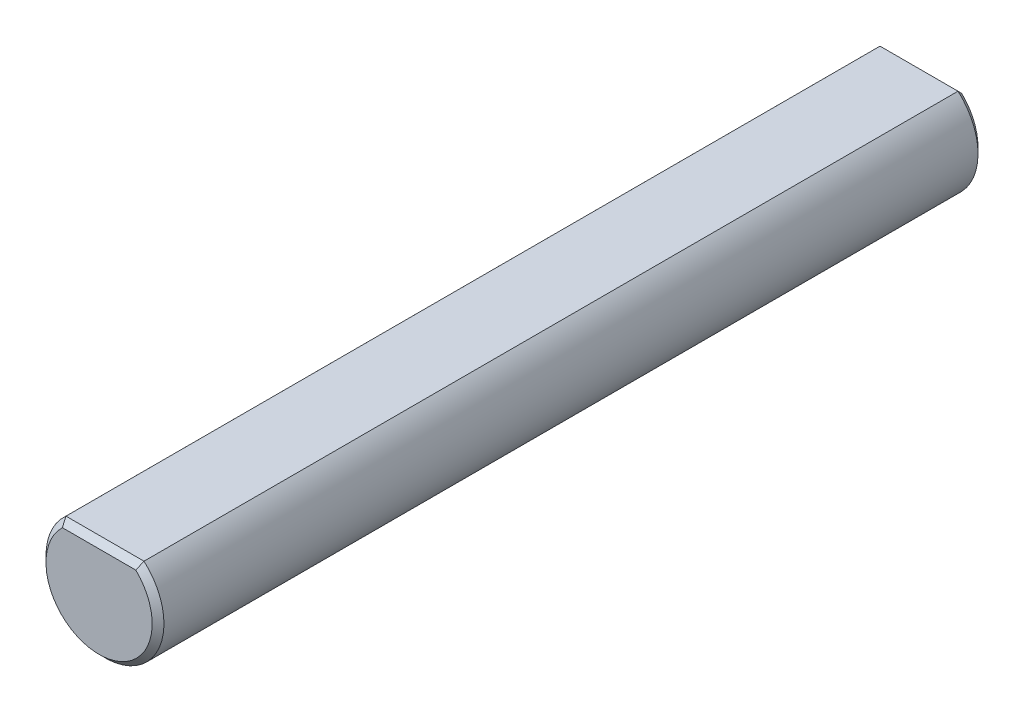
ISO-10303-21;
HEADER;
FILE_DESCRIPTION(('STEP AP214'),'2;1');
FILE_NAME('part.step','',(''),(''),'','','');
FILE_SCHEMA(('AUTOMOTIVE_DESIGN { 1 0 10303 214 1 1 1 1 }'));
ENDSEC;
DATA;
#1=APPLICATION_CONTEXT('core data for automotive mechanical design processes');
#2=APPLICATION_PROTOCOL_DEFINITION('international standard','automotive_design',2000,#1);
#3=PRODUCT_CONTEXT('',#1,'mechanical');
#4=PRODUCT('Part','Part','',(#3));
#5=PRODUCT_RELATED_PRODUCT_CATEGORY('part','',(#4));
#6=PRODUCT_DEFINITION_FORMATION('','',#4);
#7=PRODUCT_DEFINITION_CONTEXT('part definition',#1,'design');
#8=PRODUCT_DEFINITION('design','',#6,#7);
#9=PRODUCT_DEFINITION_SHAPE('','',#8);
#10=(LENGTH_UNIT() NAMED_UNIT(*) SI_UNIT(.MILLI.,.METRE.));
#11=(NAMED_UNIT(*) PLANE_ANGLE_UNIT() SI_UNIT($,.RADIAN.));
#12=(NAMED_UNIT(*) SI_UNIT($,.STERADIAN.) SOLID_ANGLE_UNIT());
#13=UNCERTAINTY_MEASURE_WITH_UNIT(LENGTH_MEASURE(1.E-05),#10,'distance_accuracy_value','');
#14=(GEOMETRIC_REPRESENTATION_CONTEXT(3) GLOBAL_UNCERTAINTY_ASSIGNED_CONTEXT((#13)) GLOBAL_UNIT_ASSIGNED_CONTEXT((#10,
#11,#12)) REPRESENTATION_CONTEXT('',''));
#15=CARTESIAN_POINT('',(0.,0.,0.));
#16=DIRECTION('',(0.,0.,1.));
#17=DIRECTION('',(1.,0.,0.));
#18=AXIS2_PLACEMENT_3D('',#15,#16,#17);
#19=CARTESIAN_POINT('',(0.,1.5,27.8));
#20=DIRECTION('',(0.,-0.707106781186548,-0.707106781186548));
#21=DIRECTION('',(0.,0.707106781186548,-0.707106781186548));
#22=AXIS2_PLACEMENT_3D('',#19,#20,#21);
#23=PLANE('',#22);
#24=CARTESIAN_POINT('',(-1.24498995975797,1.30000000002028,27.9999999999797));
#25=CARTESIAN_POINT('',(-1.25833682015506,1.33326211368723,27.9667378863128));
#26=CARTESIAN_POINT('',(-1.27150072999943,1.36655985043145,27.9334401495685));
#27=CARTESIAN_POINT('',(-1.29746262799343,1.43322651720392,27.8667734827961));
#28=CARTESIAN_POINT('',(-1.31026061672343,1.46659544711915,27.8334045528808));
#29=CARTESIAN_POINT('',(-1.32287565548107,1.49999999999866,27.8000000000013));
#30=B_SPLINE_CURVE_WITH_KNOTS('',3,(#24,#25,#26,#27,#28,#29),.UNSPECIFIED.,.F.,.F.,(4,2,4),(0.,
0.146686412467866,0.29337259227421),.UNSPECIFIED.);
#31=CARTESIAN_POINT('',(-1.24498995977646,1.3,27.9999999999816));
#32=VERTEX_POINT('',#31);
#33=CARTESIAN_POINT('',(-1.32287565550642,1.49999999999938,27.8000000000006));
#34=VERTEX_POINT('',#33);
#35=EDGE_CURVE('E62',#32,#34,#30,.T.);
#36=ORIENTED_EDGE('',*,*,#35,.F.);
#37=DIRECTION('',(1.,0.,0.));
#38=VECTOR('',#37,1.);
#39=CARTESIAN_POINT('',(0.,1.3,28.));
#40=LINE('',#39,#38);
#41=CARTESIAN_POINT('',(1.24498995978053,1.30000000001014,27.9999999999714));
#42=VERTEX_POINT('',#41);
#43=EDGE_CURVE('E74',#42,#32,#40,.F.);
#44=ORIENTED_EDGE('',*,*,#43,.F.);
#45=CARTESIAN_POINT('',(1.32287565548092,1.49999999999977,27.8000000000002));
#46=CARTESIAN_POINT('',(1.31026061672342,1.46659544712006,27.8334045528799));
#47=CARTESIAN_POINT('',(1.29746262799354,1.43322651720462,27.8667734827954));
#48=CARTESIAN_POINT('',(1.27150072999972,1.36655985043176,27.9334401495682));
#49=CARTESIAN_POINT('',(1.25833682015543,1.33326211368734,27.9667378863127));
#50=CARTESIAN_POINT('',(1.24498995975839,1.3000000000202,27.9999999999798));
#51=B_SPLINE_CURVE_WITH_KNOTS('',3,(#45,#46,#47,#48,#49,#50),.UNSPECIFIED.,.F.,.F.,(4,2,4),(0.,
0.146686179807085,0.293372592275692),.UNSPECIFIED.);
#52=CARTESIAN_POINT('',(1.32287565550661,1.49999999999989,27.7999999999981));
#53=VERTEX_POINT('',#52);
#54=EDGE_CURVE('E21',#53,#42,#51,.T.);
#55=ORIENTED_EDGE('',*,*,#54,.F.);
#56=DIRECTION('',(1.,0.,0.));
#57=VECTOR('',#56,1.);
#58=CARTESIAN_POINT('',(0.,1.5,27.8));
#59=LINE('',#58,#57);
#60=EDGE_CURVE('E72',#34,#53,#59,.T.);
#61=ORIENTED_EDGE('',*,*,#60,.F.);
#62=EDGE_LOOP('',(#36,#44,#55,#61));
#63=FACE_BOUND('',#62,.T.);
#64=ADVANCED_FACE('F17',(#63),#23,.F.);
#65=CARTESIAN_POINT('',(0.,1.3,0.));
#66=DIRECTION('',(0.,0.707106781186548,-0.707106781186548));
#67=DIRECTION('',(0.,0.707106781186548,0.707106781186548));
#68=AXIS2_PLACEMENT_3D('',#65,#66,#67);
#69=PLANE('',#68);
#70=CARTESIAN_POINT('',(1.24498995966782,1.30000000007248,5.93277109297435E-11));
#71=CARTESIAN_POINT('',(1.25833682006215,1.33326211373519,0.0332621137286123));
#72=CARTESIAN_POINT('',(1.27150072990419,1.36655985047618,0.0665598504739916));
#73=CARTESIAN_POINT('',(1.29746262789441,1.43322651724421,0.133226517246398));
#74=CARTESIAN_POINT('',(1.31026061662295,1.46659544715823,0.166595447160421));
#75=CARTESIAN_POINT('',(1.32287565537957,1.50000000003754,0.200000000037534));
#76=B_SPLINE_CURVE_WITH_KNOTS('',3,(#70,#71,#72,#73,#74,#75),.UNSPECIFIED.,.F.,.F.,(4,2,4),(0.,
0.146686412461755,0.293372592261994),.UNSPECIFIED.);
#77=CARTESIAN_POINT('',(1.24498995972612,1.30000000004097,9.00401118724553E-11));
#78=VERTEX_POINT('',#77);
#79=CARTESIAN_POINT('',(1.32287565544856,1.5,0.199999999999999));
#80=VERTEX_POINT('',#79);
#81=EDGE_CURVE('E75',#78,#80,#76,.T.);
#82=ORIENTED_EDGE('',*,*,#81,.F.);
#83=DIRECTION('',(1.,0.,0.));
#84=VECTOR('',#83,1.);
#85=CARTESIAN_POINT('',(0.,1.30000000001554,0.));
#86=LINE('',#85,#84);
#87=CARTESIAN_POINT('',(-1.24498995972612,1.30000000004097,9.0040118703576E-11));
#88=VERTEX_POINT('',#87);
#89=EDGE_CURVE('E87',#78,#88,#86,.F.);
#90=ORIENTED_EDGE('',*,*,#89,.T.);
#91=CARTESIAN_POINT('',(-1.32287565538393,1.50000000005057,0.200000000020285));
#92=CARTESIAN_POINT('',(-1.31026061662532,1.46659544716538,0.166595447150239));
#93=CARTESIAN_POINT('',(-1.29746262789525,1.43322651724682,0.133226517241769));
#94=CARTESIAN_POINT('',(-1.27150072990289,1.36655985047239,0.0665598504774322));
#95=CARTESIAN_POINT('',(-1.25833682006025,1.33326211372952,0.03326211373457));
#96=CARTESIAN_POINT('',(-1.24498995966578,1.30000000006629,6.62876525466181E-11));
#97=B_SPLINE_CURVE_WITH_KNOTS('',3,(#91,#92,#93,#94,#95,#96),.UNSPECIFIED.,.F.,.F.,(4,2,4),(0.,
0.146686179799369,0.293372592260281),.UNSPECIFIED.);
#98=CARTESIAN_POINT('',(-1.32287565545544,1.50000000001822,0.2000000000199));
#99=VERTEX_POINT('',#98);
#100=EDGE_CURVE('E91',#99,#88,#97,.T.);
#101=ORIENTED_EDGE('',*,*,#100,.F.);
#102=DIRECTION('',(1.,0.,0.));
#103=VECTOR('',#102,1.);
#104=CARTESIAN_POINT('',(0.,1.5,0.199999999999999));
#105=LINE('',#104,#103);
#106=EDGE_CURVE('E82',#80,#99,#105,.F.);
#107=ORIENTED_EDGE('',*,*,#106,.F.);
#108=EDGE_LOOP('',(#82,#90,#101,#107));
#109=FACE_BOUND('',#108,.T.);
#110=ADVANCED_FACE('F110',(#109),#69,.T.);
#111=CARTESIAN_POINT('',(0.,0.,28.));
#112=DIRECTION('',(0.,0.,1.));
#113=DIRECTION('',(1.,0.,0.));
#114=AXIS2_PLACEMENT_3D('',#111,#112,#113);
#115=PLANE('',#114);
#116=ORIENTED_EDGE('',*,*,#43,.T.);
#117=CARTESIAN_POINT('',(0.,0.,27.9999999999632));
#118=DIRECTION('',(0.,0.,-1.));
#119=DIRECTION('',(-1.,0.,0.));
#120=AXIS2_PLACEMENT_3D('',#117,#118,#119);
#121=CIRCLE('',#120,1.80000000000291);
#122=EDGE_CURVE('E86',#42,#32,#121,.T.);
#123=ORIENTED_EDGE('',*,*,#122,.F.);
#124=EDGE_LOOP('',(#116,#123));
#125=FACE_BOUND('',#124,.T.);
#126=ADVANCED_FACE('F114',(#125),#115,.T.);
#127=CARTESIAN_POINT('',(0.,1.5,28.));
#128=DIRECTION('',(0.,1.,0.));
#129=DIRECTION('',(0.,0.,1.));
#130=AXIS2_PLACEMENT_3D('',#127,#128,#129);
#131=PLANE('',#130);
#132=DIRECTION('',(0.,0.,-1.));
#133=VECTOR('',#132,1.);
#134=CARTESIAN_POINT('',(1.32287565550936,1.50000000002023,28.));
#135=LINE('',#134,#133);
#136=EDGE_CURVE('E80',#80,#53,#135,.F.);
#137=ORIENTED_EDGE('',*,*,#136,.F.);
#138=ORIENTED_EDGE('',*,*,#106,.T.);
#139=DIRECTION('',(0.,0.,-1.));
#140=VECTOR('',#139,1.);
#141=CARTESIAN_POINT('',(-1.32287565551787,1.50000000001272,28.));
#142=LINE('',#141,#140);
#143=EDGE_CURVE('E81',#34,#99,#142,.T.);
#144=ORIENTED_EDGE('',*,*,#143,.F.);
#145=ORIENTED_EDGE('',*,*,#60,.T.);
#146=EDGE_LOOP('',(#137,#138,#144,#145));
#147=FACE_BOUND('',#146,.T.);
#148=ADVANCED_FACE('F78',(#147),#131,.T.);
#149=CARTESIAN_POINT('',(0.,0.,0.));
#150=DIRECTION('',(0.,0.,1.));
#151=DIRECTION('',(1.,0.,0.));
#152=AXIS2_PLACEMENT_3D('',#149,#150,#151);
#153=PLANE('',#152);
#154=ORIENTED_EDGE('',*,*,#89,.F.);
#155=CARTESIAN_POINT('',(0.,0.,1.13686837721616E-10));
#156=DIRECTION('',(0.,0.,1.));
#157=DIRECTION('',(1.,0.,0.));
#158=AXIS2_PLACEMENT_3D('',#155,#156,#157);
#159=CIRCLE('',#158,1.80000000000291);
#160=EDGE_CURVE('E68',#88,#78,#159,.T.);
#161=ORIENTED_EDGE('',*,*,#160,.F.);
#162=EDGE_LOOP('',(#154,#161));
#163=FACE_BOUND('',#162,.T.);
#164=ADVANCED_FACE('F129',(#163),#153,.F.);
#165=CARTESIAN_POINT('',(0.,0.,27.8000000000702));
#166=DIRECTION('',(0.,0.,-1.));
#167=DIRECTION('',(-1.,0.,0.));
#168=AXIS2_PLACEMENT_3D('',#165,#166,#167);
#169=CONICAL_SURFACE('',#168,1.99999999989586,0.785398163397448);
#170=ORIENTED_EDGE('',*,*,#122,.T.);
#171=ORIENTED_EDGE('',*,*,#35,.T.);
#172=CARTESIAN_POINT('',(0.,0.,27.8));
#173=DIRECTION('',(0.,0.,-1.));
#174=DIRECTION('',(-1.,0.,0.));
#175=AXIS2_PLACEMENT_3D('',#172,#173,#174);
#176=CIRCLE('',#175,2.);
#177=EDGE_CURVE('E31',#53,#34,#176,.T.);
#178=ORIENTED_EDGE('',*,*,#177,.F.);
#179=ORIENTED_EDGE('',*,*,#54,.T.);
#180=EDGE_LOOP('',(#170,#171,#178,#179));
#181=FACE_BOUND('',#180,.T.);
#182=ADVANCED_FACE('F59',(#181),#169,.T.);
#183=CARTESIAN_POINT('',(0.,0.,0.200000000063483));
#184=DIRECTION('',(0.,0.,1.));
#185=DIRECTION('',(1.,0.,0.));
#186=AXIS2_PLACEMENT_3D('',#183,#184,#185);
#187=CONICAL_SURFACE('',#186,1.99999999995271,0.785398163397448);
#188=ORIENTED_EDGE('',*,*,#160,.T.);
#189=ORIENTED_EDGE('',*,*,#81,.T.);
#190=CARTESIAN_POINT('',(0.,0.,0.199999999999999));
#191=DIRECTION('',(0.,0.,-1.));
#192=DIRECTION('',(-1.,0.,0.));
#193=AXIS2_PLACEMENT_3D('',#190,#191,#192);
#194=CIRCLE('',#193,2.);
#195=EDGE_CURVE('E10',#99,#80,#194,.F.);
#196=ORIENTED_EDGE('',*,*,#195,.F.);
#197=ORIENTED_EDGE('',*,*,#100,.T.);
#198=EDGE_LOOP('',(#188,#189,#196,#197));
#199=FACE_BOUND('',#198,.T.);
#200=ADVANCED_FACE('F107',(#199),#187,.T.);
#201=CARTESIAN_POINT('',(0.,0.,28.));
#202=DIRECTION('',(0.,0.,-1.));
#203=DIRECTION('',(-1.,0.,0.));
#204=AXIS2_PLACEMENT_3D('',#201,#202,#203);
#205=CYLINDRICAL_SURFACE('',#204,2.);
#206=ORIENTED_EDGE('',*,*,#177,.T.);
#207=ORIENTED_EDGE('',*,*,#143,.T.);
#208=ORIENTED_EDGE('',*,*,#195,.T.);
#209=ORIENTED_EDGE('',*,*,#136,.T.);
#210=EDGE_LOOP('',(#206,#207,#208,#209));
#211=FACE_BOUND('',#210,.T.);
#212=ADVANCED_FACE('F84',(#211),#205,.T.);
#213=CLOSED_SHELL('',(#64,#110,#126,#148,#164,#182,#200,#212));
#214=MANIFOLD_SOLID_BREP('B1',#213);
#215=ADVANCED_BREP_SHAPE_REPRESENTATION('',(#18,#214),#14);
#216=SHAPE_DEFINITION_REPRESENTATION(#9,#215);
ENDSEC;
END-ISO-10303-21;
